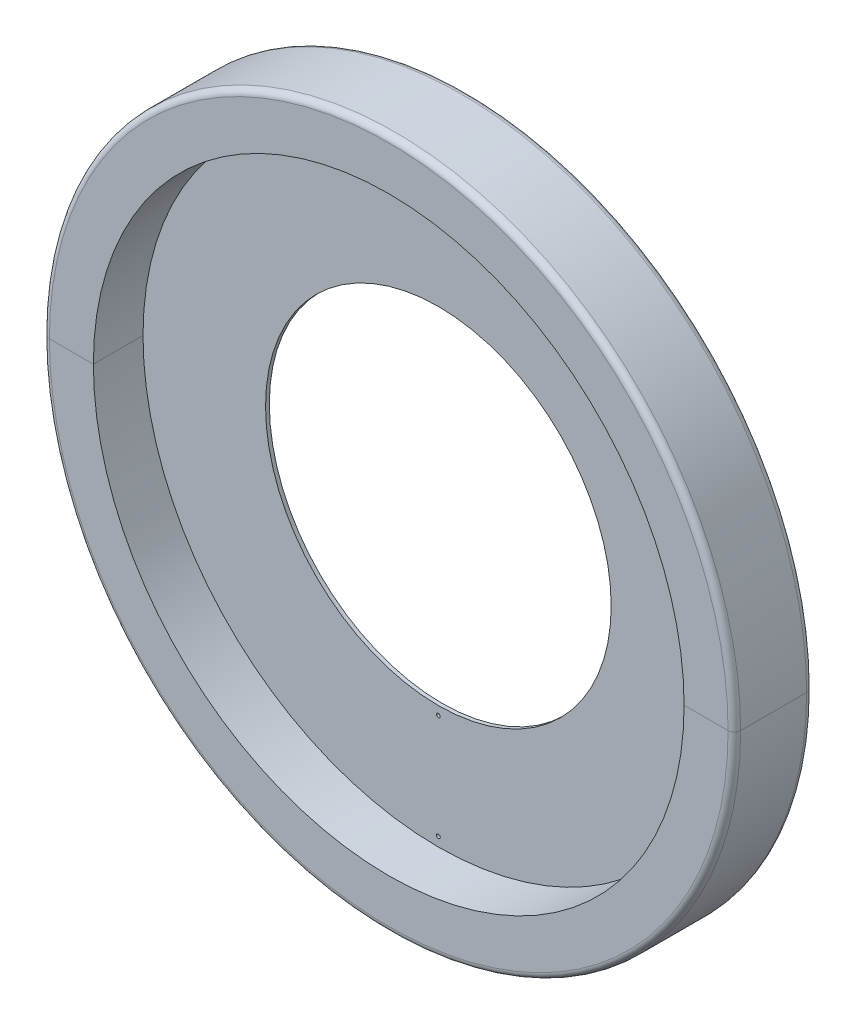
ISO-10303-21;
HEADER;
FILE_DESCRIPTION(('STEP AP214'),'2;1');
FILE_NAME('part.step','',(''),(''),'','','');
FILE_SCHEMA(('AUTOMOTIVE_DESIGN { 1 0 10303 214 1 1 1 1 }'));
ENDSEC;
DATA;
#1=APPLICATION_CONTEXT('core data for automotive mechanical design processes');
#2=APPLICATION_PROTOCOL_DEFINITION('international standard','automotive_design',2000,#1);
#3=PRODUCT_CONTEXT('',#1,'mechanical');
#4=PRODUCT('Part','Part','',(#3));
#5=PRODUCT_RELATED_PRODUCT_CATEGORY('part','',(#4));
#6=PRODUCT_DEFINITION_FORMATION('','',#4);
#7=PRODUCT_DEFINITION_CONTEXT('part definition',#1,'design');
#8=PRODUCT_DEFINITION('design','',#6,#7);
#9=PRODUCT_DEFINITION_SHAPE('','',#8);
#10=(LENGTH_UNIT() NAMED_UNIT(*) SI_UNIT(.MILLI.,.METRE.));
#11=(NAMED_UNIT(*) PLANE_ANGLE_UNIT() SI_UNIT($,.RADIAN.));
#12=(NAMED_UNIT(*) SI_UNIT($,.STERADIAN.) SOLID_ANGLE_UNIT());
#13=UNCERTAINTY_MEASURE_WITH_UNIT(LENGTH_MEASURE(1.E-05),#10,'distance_accuracy_value','');
#14=(GEOMETRIC_REPRESENTATION_CONTEXT(3) GLOBAL_UNCERTAINTY_ASSIGNED_CONTEXT((#13)) GLOBAL_UNIT_ASSIGNED_CONTEXT((#10,
#11,#12)) REPRESENTATION_CONTEXT('',''));
#15=CARTESIAN_POINT('',(0.,0.,0.));
#16=DIRECTION('',(0.,0.,1.));
#17=DIRECTION('',(1.,0.,0.));
#18=AXIS2_PLACEMENT_3D('',#15,#16,#17);
#19=CARTESIAN_POINT('',(0.,0.,6.));
#20=DIRECTION('',(0.,0.,1.));
#21=DIRECTION('',(1.,0.,0.));
#22=AXIS2_PLACEMENT_3D('',#19,#20,#21);
#23=PLANE('',#22);
#24=CARTESIAN_POINT('',(0.,-455.,6.));
#25=DIRECTION('',(0.,0.,1.));
#26=DIRECTION('',(1.,0.,0.));
#27=AXIS2_PLACEMENT_3D('',#24,#25,#26);
#28=CIRCLE('',#27,3.);
#29=CARTESIAN_POINT('',(3.,-455.,6.));
#30=VERTEX_POINT('',#29);
#31=EDGE_CURVE('E224',#30,#30,#28,.T.);
#32=ORIENTED_EDGE('',*,*,#31,.F.);
#33=EDGE_LOOP('',(#32));
#34=FACE_BOUND('',#33,.T.);
#35=CARTESIAN_POINT('',(0.,-288.71,6.));
#36=DIRECTION('',(0.,0.,1.));
#37=DIRECTION('',(1.,0.,0.));
#38=AXIS2_PLACEMENT_3D('',#35,#36,#37);
#39=CIRCLE('',#38,3.);
#40=CARTESIAN_POINT('',(3.,-288.71,6.));
#41=VERTEX_POINT('',#40);
#42=EDGE_CURVE('E228',#41,#41,#39,.T.);
#43=ORIENTED_EDGE('',*,*,#42,.F.);
#44=EDGE_LOOP('',(#43));
#45=FACE_BOUND('',#44,.T.);
#46=CARTESIAN_POINT('',(0.,0.,6.));
#47=DIRECTION('',(0.,0.,1.));
#48=DIRECTION('',(1.,0.,0.));
#49=AXIS2_PLACEMENT_3D('',#46,#47,#48);
#50=CIRCLE('',#49,275.);
#51=CARTESIAN_POINT('',(275.,0.,6.));
#52=VERTEX_POINT('',#51);
#53=EDGE_CURVE('E223',#52,#52,#50,.T.);
#54=ORIENTED_EDGE('',*,*,#53,.F.);
#55=EDGE_LOOP('',(#54));
#56=FACE_BOUND('',#55,.T.);
#57=CARTESIAN_POINT('',(0.,0.,6.));
#58=DIRECTION('',(0.,0.,1.));
#59=DIRECTION('',(1.,0.,0.));
#60=AXIS2_PLACEMENT_3D('',#57,#58,#59);
#61=CIRCLE('',#60,470.);
#62=CARTESIAN_POINT('',(470.,0.,6.));
#63=VERTEX_POINT('',#62);
#64=CARTESIAN_POINT('',(-470.,0.,6.00000000000001));
#65=VERTEX_POINT('',#64);
#66=EDGE_CURVE('E11',#63,#65,#61,.T.);
#67=ORIENTED_EDGE('',*,*,#66,.T.);
#68=EDGE_CURVE('E53',#65,#63,#61,.T.);
#69=ORIENTED_EDGE('',*,*,#68,.T.);
#70=EDGE_LOOP('',(#67,#69));
#71=FACE_BOUND('',#70,.T.);
#72=ADVANCED_FACE('F43',(#34,#45,#56,#71),#23,.T.);
#73=CARTESIAN_POINT('',(0.,0.,0.));
#74=DIRECTION('',(0.,0.,1.));
#75=DIRECTION('',(1.,0.,0.));
#76=AXIS2_PLACEMENT_3D('',#73,#74,#75);
#77=PLANE('',#76);
#78=CARTESIAN_POINT('',(0.,-455.,0.));
#79=DIRECTION('',(0.,0.,1.));
#80=DIRECTION('',(1.,0.,0.));
#81=AXIS2_PLACEMENT_3D('',#78,#79,#80);
#82=CIRCLE('',#81,3.);
#83=CARTESIAN_POINT('',(3.,-455.,0.));
#84=VERTEX_POINT('',#83);
#85=EDGE_CURVE('E219',#84,#84,#82,.T.);
#86=ORIENTED_EDGE('',*,*,#85,.T.);
#87=EDGE_LOOP('',(#86));
#88=FACE_BOUND('',#87,.T.);
#89=CARTESIAN_POINT('',(0.,-288.71,0.));
#90=DIRECTION('',(0.,0.,1.));
#91=DIRECTION('',(1.,0.,0.));
#92=AXIS2_PLACEMENT_3D('',#89,#90,#91);
#93=CIRCLE('',#92,3.);
#94=CARTESIAN_POINT('',(3.,-288.71,0.));
#95=VERTEX_POINT('',#94);
#96=EDGE_CURVE('E232',#95,#95,#93,.T.);
#97=ORIENTED_EDGE('',*,*,#96,.T.);
#98=EDGE_LOOP('',(#97));
#99=FACE_BOUND('',#98,.T.);
#100=CARTESIAN_POINT('',(0.,0.,0.));
#101=DIRECTION('',(0.,0.,1.));
#102=DIRECTION('',(1.,0.,0.));
#103=AXIS2_PLACEMENT_3D('',#100,#101,#102);
#104=CIRCLE('',#103,275.);
#105=CARTESIAN_POINT('',(275.,0.,0.));
#106=VERTEX_POINT('',#105);
#107=EDGE_CURVE('E236',#106,#106,#104,.T.);
#108=ORIENTED_EDGE('',*,*,#107,.T.);
#109=EDGE_LOOP('',(#108));
#110=FACE_BOUND('',#109,.T.);
#111=CARTESIAN_POINT('',(0.,0.,0.));
#112=DIRECTION('',(0.,0.,1.));
#113=DIRECTION('',(1.,0.,0.));
#114=AXIS2_PLACEMENT_3D('',#111,#112,#113);
#115=CIRCLE('',#114,470.);
#116=CARTESIAN_POINT('',(470.,0.,0.));
#117=VERTEX_POINT('',#116);
#118=CARTESIAN_POINT('',(-470.,0.,0.));
#119=VERTEX_POINT('',#118);
#120=EDGE_CURVE('E47',#117,#119,#115,.T.);
#121=ORIENTED_EDGE('',*,*,#120,.F.);
#122=CARTESIAN_POINT('',(0.,0.,0.));
#123=DIRECTION('',(0.,0.,-1.));
#124=DIRECTION('',(1.,0.,0.));
#125=AXIS2_PLACEMENT_3D('',#122,#123,#124);
#126=CIRCLE('',#125,470.);
#127=EDGE_CURVE('E67',#117,#119,#126,.T.);
#128=ORIENTED_EDGE('',*,*,#127,.T.);
#129=EDGE_LOOP('',(#121,#128));
#130=FACE_BOUND('',#129,.T.);
#131=ADVANCED_FACE('F45',(#88,#99,#110,#130),#77,.F.);
#132=CARTESIAN_POINT('',(0.,0.,0.));
#133=DIRECTION('',(0.,0.,1.));
#134=DIRECTION('',(1.,0.,0.));
#135=AXIS2_PLACEMENT_3D('',#132,#133,#134);
#136=CYLINDRICAL_SURFACE('',#135,275.);
#137=ORIENTED_EDGE('',*,*,#107,.F.);
#138=EDGE_LOOP('',(#137));
#139=FACE_BOUND('',#138,.T.);
#140=ORIENTED_EDGE('',*,*,#53,.T.);
#141=EDGE_LOOP('',(#140));
#142=FACE_BOUND('',#141,.T.);
#143=ADVANCED_FACE('F244',(#139,#142),#136,.F.);
#144=CARTESIAN_POINT('',(0.,-288.71,0.));
#145=DIRECTION('',(0.,0.,1.));
#146=DIRECTION('',(1.,0.,0.));
#147=AXIS2_PLACEMENT_3D('',#144,#145,#146);
#148=CYLINDRICAL_SURFACE('',#147,3.);
#149=ORIENTED_EDGE('',*,*,#96,.F.);
#150=EDGE_LOOP('',(#149));
#151=FACE_BOUND('',#150,.T.);
#152=ORIENTED_EDGE('',*,*,#42,.T.);
#153=EDGE_LOOP('',(#152));
#154=FACE_BOUND('',#153,.T.);
#155=ADVANCED_FACE('F260',(#151,#154),#148,.F.);
#156=CARTESIAN_POINT('',(0.,-455.,0.));
#157=DIRECTION('',(0.,0.,1.));
#158=DIRECTION('',(1.,0.,0.));
#159=AXIS2_PLACEMENT_3D('',#156,#157,#158);
#160=CYLINDRICAL_SURFACE('',#159,3.);
#161=ORIENTED_EDGE('',*,*,#85,.F.);
#162=EDGE_LOOP('',(#161));
#163=FACE_BOUND('',#162,.T.);
#164=ORIENTED_EDGE('',*,*,#31,.T.);
#165=EDGE_LOOP('',(#164));
#166=FACE_BOUND('',#165,.T.);
#167=ADVANCED_FACE('F264',(#163,#166),#160,.F.);
#168=CARTESIAN_POINT('',(0.,0.,0.));
#169=DIRECTION('',(0.,0.,-1.));
#170=DIRECTION('',(-1.,0.,0.));
#171=AXIS2_PLACEMENT_3D('',#168,#169,#170);
#172=CYLINDRICAL_SURFACE('',#171,470.);
#173=ORIENTED_EDGE('',*,*,#66,.F.);
#174=DIRECTION('',(0.,0.,-1.));
#175=VECTOR('',#174,1.);
#176=CARTESIAN_POINT('',(470.,0.,85.));
#177=LINE('',#176,#175);
#178=CARTESIAN_POINT('',(470.,0.,85.));
#179=VERTEX_POINT('',#178);
#180=EDGE_CURVE('E60',#179,#63,#177,.T.);
#181=ORIENTED_EDGE('',*,*,#180,.F.);
#182=CARTESIAN_POINT('',(0.,0.,85.));
#183=DIRECTION('',(0.,0.,-1.));
#184=DIRECTION('',(-1.,0.,0.));
#185=AXIS2_PLACEMENT_3D('',#182,#183,#184);
#186=CIRCLE('',#185,470.);
#187=CARTESIAN_POINT('',(-470.,0.,85.));
#188=VERTEX_POINT('',#187);
#189=EDGE_CURVE('E124',#188,#179,#186,.T.);
#190=ORIENTED_EDGE('',*,*,#189,.F.);
#191=DIRECTION('',(0.,0.,-1.));
#192=VECTOR('',#191,1.);
#193=CARTESIAN_POINT('',(-470.,0.,85.));
#194=LINE('',#193,#192);
#195=EDGE_CURVE('E126',#188,#65,#194,.T.);
#196=ORIENTED_EDGE('',*,*,#195,.T.);
#197=EDGE_LOOP('',(#173,#181,#190,#196));
#198=FACE_BOUND('',#197,.T.);
#199=ADVANCED_FACE('F125',(#198),#172,.F.);
#200=CARTESIAN_POINT('',(0.,0.,0.));
#201=DIRECTION('',(0.,0.,-1.));
#202=DIRECTION('',(-1.,0.,0.));
#203=AXIS2_PLACEMENT_3D('',#200,#201,#202);
#204=CYLINDRICAL_SURFACE('',#203,470.);
#205=ORIENTED_EDGE('',*,*,#68,.F.);
#206=ORIENTED_EDGE('',*,*,#195,.F.);
#207=CARTESIAN_POINT('',(0.,0.,85.));
#208=DIRECTION('',(0.,0.,-1.));
#209=DIRECTION('',(1.,0.,0.));
#210=AXIS2_PLACEMENT_3D('',#207,#208,#209);
#211=CIRCLE('',#210,470.);
#212=EDGE_CURVE('E110',#179,#188,#211,.T.);
#213=ORIENTED_EDGE('',*,*,#212,.F.);
#214=ORIENTED_EDGE('',*,*,#180,.T.);
#215=EDGE_LOOP('',(#205,#206,#213,#214));
#216=FACE_BOUND('',#215,.T.);
#217=ADVANCED_FACE('F137',(#216),#204,.F.);
#218=CARTESIAN_POINT('',(540.,0.,85.));
#219=DIRECTION('',(0.,0.,1.));
#220=DIRECTION('',(1.,0.,0.));
#221=AXIS2_PLACEMENT_3D('',#218,#219,#220);
#222=PLANE('',#221);
#223=CARTESIAN_POINT('',(0.,0.,85.));
#224=DIRECTION('',(0.,0.,-1.));
#225=DIRECTION('',(1.,0.,0.));
#226=AXIS2_PLACEMENT_3D('',#223,#224,#225);
#227=CIRCLE('',#226,540.);
#228=CARTESIAN_POINT('',(540.,0.,85.));
#229=VERTEX_POINT('',#228);
#230=CARTESIAN_POINT('',(-540.,0.,85.));
#231=VERTEX_POINT('',#230);
#232=EDGE_CURVE('E207',#229,#231,#227,.T.);
#233=ORIENTED_EDGE('',*,*,#232,.F.);
#234=DIRECTION('',(-1.,0.,0.));
#235=VECTOR('',#234,1.);
#236=CARTESIAN_POINT('',(540.,0.,85.));
#237=LINE('',#236,#235);
#238=EDGE_CURVE('E117',#229,#179,#237,.T.);
#239=ORIENTED_EDGE('',*,*,#238,.T.);
#240=ORIENTED_EDGE('',*,*,#212,.T.);
#241=DIRECTION('',(1.,0.,0.));
#242=VECTOR('',#241,1.);
#243=CARTESIAN_POINT('',(-540.,0.,85.));
#244=LINE('',#243,#242);
#245=EDGE_CURVE('E114',#231,#188,#244,.T.);
#246=ORIENTED_EDGE('',*,*,#245,.F.);
#247=EDGE_LOOP('',(#233,#239,#240,#246));
#248=FACE_BOUND('',#247,.T.);
#249=ADVANCED_FACE('F112',(#248),#222,.T.);
#250=CARTESIAN_POINT('',(0.,0.,75.));
#251=DIRECTION('',(0.,0.,-1.));
#252=DIRECTION('',(-1.,0.,0.));
#253=AXIS2_PLACEMENT_3D('',#250,#251,#252);
#254=TOROIDAL_SURFACE('',#253,540.,10.);
#255=CARTESIAN_POINT('',(0.,0.,74.9999999999999));
#256=DIRECTION('',(0.,0.,-1.));
#257=DIRECTION('',(1.,0.,0.));
#258=AXIS2_PLACEMENT_3D('',#255,#256,#257);
#259=CIRCLE('',#258,550.);
#260=CARTESIAN_POINT('',(550.,0.,74.9999999999999));
#261=VERTEX_POINT('',#260);
#262=CARTESIAN_POINT('',(-550.,0.,74.9999999999999));
#263=VERTEX_POINT('',#262);
#264=EDGE_CURVE('E193',#261,#263,#259,.T.);
#265=ORIENTED_EDGE('',*,*,#264,.F.);
#266=CARTESIAN_POINT('',(540.,0.,75.));
#267=DIRECTION('',(0.,-1.,0.));
#268=DIRECTION('',(0.,0.,1.));
#269=AXIS2_PLACEMENT_3D('',#266,#267,#268);
#270=CIRCLE('',#269,10.);
#271=EDGE_CURVE('E204',#261,#229,#270,.T.);
#272=ORIENTED_EDGE('',*,*,#271,.T.);
#273=ORIENTED_EDGE('',*,*,#232,.T.);
#274=CARTESIAN_POINT('',(-540.,0.,75.));
#275=DIRECTION('',(0.,1.,0.));
#276=DIRECTION('',(0.,0.,1.));
#277=AXIS2_PLACEMENT_3D('',#274,#275,#276);
#278=CIRCLE('',#277,10.);
#279=EDGE_CURVE('E135',#263,#231,#278,.T.);
#280=ORIENTED_EDGE('',*,*,#279,.F.);
#281=EDGE_LOOP('',(#265,#272,#273,#280));
#282=FACE_BOUND('',#281,.T.);
#283=ADVANCED_FACE('F271',(#282),#254,.T.);
#284=CARTESIAN_POINT('',(0.,0.,0.));
#285=DIRECTION('',(0.,0.,-1.));
#286=DIRECTION('',(-1.,0.,0.));
#287=AXIS2_PLACEMENT_3D('',#284,#285,#286);
#288=CYLINDRICAL_SURFACE('',#287,550.);
#289=CARTESIAN_POINT('',(0.,0.,-29.9999999999999));
#290=DIRECTION('',(0.,0.,-1.));
#291=DIRECTION('',(1.,0.,0.));
#292=AXIS2_PLACEMENT_3D('',#289,#290,#291);
#293=CIRCLE('',#292,550.);
#294=CARTESIAN_POINT('',(550.,0.,-29.9999999999999));
#295=VERTEX_POINT('',#294);
#296=CARTESIAN_POINT('',(-550.,0.,-29.9999999999999));
#297=VERTEX_POINT('',#296);
#298=EDGE_CURVE('E178',#295,#297,#293,.T.);
#299=ORIENTED_EDGE('',*,*,#298,.F.);
#300=DIRECTION('',(0.,0.,1.));
#301=VECTOR('',#300,1.);
#302=CARTESIAN_POINT('',(550.,0.,-29.9999999999999));
#303=LINE('',#302,#301);
#304=EDGE_CURVE('E190',#295,#261,#303,.T.);
#305=ORIENTED_EDGE('',*,*,#304,.T.);
#306=ORIENTED_EDGE('',*,*,#264,.T.);
#307=DIRECTION('',(0.,0.,1.));
#308=VECTOR('',#307,1.);
#309=CARTESIAN_POINT('',(-550.,0.,-29.9999999999999));
#310=LINE('',#309,#308);
#311=EDGE_CURVE('E182',#297,#263,#310,.T.);
#312=ORIENTED_EDGE('',*,*,#311,.F.);
#313=EDGE_LOOP('',(#299,#305,#306,#312));
#314=FACE_BOUND('',#313,.T.);
#315=ADVANCED_FACE('F278',(#314),#288,.T.);
#316=CARTESIAN_POINT('',(0.,0.,-30.));
#317=DIRECTION('',(0.,0.,-1.));
#318=DIRECTION('',(-1.,0.,0.));
#319=AXIS2_PLACEMENT_3D('',#316,#317,#318);
#320=TOROIDAL_SURFACE('',#319,540.,10.);
#321=CARTESIAN_POINT('',(0.,0.,-40.));
#322=DIRECTION('',(0.,0.,-1.));
#323=DIRECTION('',(1.,0.,0.));
#324=AXIS2_PLACEMENT_3D('',#321,#322,#323);
#325=CIRCLE('',#324,540.);
#326=CARTESIAN_POINT('',(540.,0.,-40.));
#327=VERTEX_POINT('',#326);
#328=CARTESIAN_POINT('',(-540.,0.,-40.));
#329=VERTEX_POINT('',#328);
#330=EDGE_CURVE('E163',#327,#329,#325,.T.);
#331=ORIENTED_EDGE('',*,*,#330,.F.);
#332=CARTESIAN_POINT('',(540.,0.,-30.));
#333=DIRECTION('',(0.,-1.,0.));
#334=DIRECTION('',(0.,0.,-1.));
#335=AXIS2_PLACEMENT_3D('',#332,#333,#334);
#336=CIRCLE('',#335,10.);
#337=EDGE_CURVE('E175',#327,#295,#336,.T.);
#338=ORIENTED_EDGE('',*,*,#337,.T.);
#339=ORIENTED_EDGE('',*,*,#298,.T.);
#340=CARTESIAN_POINT('',(-540.,0.,-30.));
#341=DIRECTION('',(0.,1.,0.));
#342=DIRECTION('',(0.,0.,-1.));
#343=AXIS2_PLACEMENT_3D('',#340,#341,#342);
#344=CIRCLE('',#343,10.);
#345=EDGE_CURVE('E167',#329,#297,#344,.T.);
#346=ORIENTED_EDGE('',*,*,#345,.F.);
#347=EDGE_LOOP('',(#331,#338,#339,#346));
#348=FACE_BOUND('',#347,.T.);
#349=ADVANCED_FACE('F286',(#348),#320,.T.);
#350=CARTESIAN_POINT('',(470.,0.,-40.));
#351=DIRECTION('',(0.,0.,-1.));
#352=DIRECTION('',(-1.,0.,0.));
#353=AXIS2_PLACEMENT_3D('',#350,#351,#352);
#354=PLANE('',#353);
#355=CARTESIAN_POINT('',(0.,0.,-40.));
#356=DIRECTION('',(0.,0.,-1.));
#357=DIRECTION('',(1.,0.,0.));
#358=AXIS2_PLACEMENT_3D('',#355,#356,#357);
#359=CIRCLE('',#358,470.);
#360=CARTESIAN_POINT('',(470.,0.,-40.));
#361=VERTEX_POINT('',#360);
#362=CARTESIAN_POINT('',(-470.,0.,-40.));
#363=VERTEX_POINT('',#362);
#364=EDGE_CURVE('E151',#361,#363,#359,.T.);
#365=ORIENTED_EDGE('',*,*,#364,.F.);
#366=DIRECTION('',(1.,0.,0.));
#367=VECTOR('',#366,1.);
#368=CARTESIAN_POINT('',(470.,0.,-40.));
#369=LINE('',#368,#367);
#370=EDGE_CURVE('E160',#361,#327,#369,.T.);
#371=ORIENTED_EDGE('',*,*,#370,.T.);
#372=ORIENTED_EDGE('',*,*,#330,.T.);
#373=DIRECTION('',(-1.,0.,0.));
#374=VECTOR('',#373,1.);
#375=CARTESIAN_POINT('',(-470.,0.,-40.));
#376=LINE('',#375,#374);
#377=EDGE_CURVE('E144',#363,#329,#376,.T.);
#378=ORIENTED_EDGE('',*,*,#377,.F.);
#379=EDGE_LOOP('',(#365,#371,#372,#378));
#380=FACE_BOUND('',#379,.T.);
#381=ADVANCED_FACE('F294',(#380),#354,.T.);
#382=CARTESIAN_POINT('',(0.,0.,0.));
#383=DIRECTION('',(0.,0.,-1.));
#384=DIRECTION('',(-1.,0.,0.));
#385=AXIS2_PLACEMENT_3D('',#382,#383,#384);
#386=CYLINDRICAL_SURFACE('',#385,470.);
#387=ORIENTED_EDGE('',*,*,#127,.F.);
#388=DIRECTION('',(0.,0.,-1.));
#389=VECTOR('',#388,1.);
#390=CARTESIAN_POINT('',(470.,0.,0.));
#391=LINE('',#390,#389);
#392=EDGE_CURVE('E148',#117,#361,#391,.T.);
#393=ORIENTED_EDGE('',*,*,#392,.T.);
#394=ORIENTED_EDGE('',*,*,#364,.T.);
#395=DIRECTION('',(0.,0.,-1.));
#396=VECTOR('',#395,1.);
#397=CARTESIAN_POINT('',(-470.,0.,0.));
#398=LINE('',#397,#396);
#399=EDGE_CURVE('E140',#119,#363,#398,.T.);
#400=ORIENTED_EDGE('',*,*,#399,.F.);
#401=EDGE_LOOP('',(#387,#393,#394,#400));
#402=FACE_BOUND('',#401,.T.);
#403=ADVANCED_FACE('F275',(#402),#386,.F.);
#404=CARTESIAN_POINT('',(-540.,0.,85.));
#405=DIRECTION('',(0.,0.,1.));
#406=DIRECTION('',(1.,0.,0.));
#407=AXIS2_PLACEMENT_3D('',#404,#405,#406);
#408=PLANE('',#407);
#409=ORIENTED_EDGE('',*,*,#238,.F.);
#410=CARTESIAN_POINT('',(0.,0.,85.));
#411=DIRECTION('',(0.,0.,-1.));
#412=DIRECTION('',(-1.,0.,0.));
#413=AXIS2_PLACEMENT_3D('',#410,#411,#412);
#414=CIRCLE('',#413,540.);
#415=EDGE_CURVE('E133',#231,#229,#414,.T.);
#416=ORIENTED_EDGE('',*,*,#415,.F.);
#417=ORIENTED_EDGE('',*,*,#245,.T.);
#418=ORIENTED_EDGE('',*,*,#189,.T.);
#419=EDGE_LOOP('',(#409,#416,#417,#418));
#420=FACE_BOUND('',#419,.T.);
#421=ADVANCED_FACE('F131',(#420),#408,.T.);
#422=CARTESIAN_POINT('',(0.,0.,75.));
#423=DIRECTION('',(0.,0.,-1.));
#424=DIRECTION('',(-1.,0.,0.));
#425=AXIS2_PLACEMENT_3D('',#422,#423,#424);
#426=TOROIDAL_SURFACE('',#425,540.,10.);
#427=ORIENTED_EDGE('',*,*,#415,.T.);
#428=ORIENTED_EDGE('',*,*,#271,.F.);
#429=CARTESIAN_POINT('',(0.,0.,74.9999999999999));
#430=DIRECTION('',(0.,0.,-1.));
#431=DIRECTION('',(-1.,0.,0.));
#432=AXIS2_PLACEMENT_3D('',#429,#430,#431);
#433=CIRCLE('',#432,550.);
#434=EDGE_CURVE('E200',#263,#261,#433,.T.);
#435=ORIENTED_EDGE('',*,*,#434,.F.);
#436=ORIENTED_EDGE('',*,*,#279,.T.);
#437=EDGE_LOOP('',(#427,#428,#435,#436));
#438=FACE_BOUND('',#437,.T.);
#439=ADVANCED_FACE('F274',(#438),#426,.T.);
#440=CARTESIAN_POINT('',(0.,0.,0.));
#441=DIRECTION('',(0.,0.,-1.));
#442=DIRECTION('',(-1.,0.,0.));
#443=AXIS2_PLACEMENT_3D('',#440,#441,#442);
#444=CYLINDRICAL_SURFACE('',#443,550.);
#445=ORIENTED_EDGE('',*,*,#434,.T.);
#446=ORIENTED_EDGE('',*,*,#304,.F.);
#447=CARTESIAN_POINT('',(0.,0.,-29.9999999999999));
#448=DIRECTION('',(0.,0.,-1.));
#449=DIRECTION('',(-1.,0.,0.));
#450=AXIS2_PLACEMENT_3D('',#447,#448,#449);
#451=CIRCLE('',#450,550.);
#452=EDGE_CURVE('E186',#297,#295,#451,.T.);
#453=ORIENTED_EDGE('',*,*,#452,.F.);
#454=ORIENTED_EDGE('',*,*,#311,.T.);
#455=EDGE_LOOP('',(#445,#446,#453,#454));
#456=FACE_BOUND('',#455,.T.);
#457=ADVANCED_FACE('F282',(#456),#444,.T.);
#458=CARTESIAN_POINT('',(0.,0.,-30.));
#459=DIRECTION('',(0.,0.,-1.));
#460=DIRECTION('',(-1.,0.,0.));
#461=AXIS2_PLACEMENT_3D('',#458,#459,#460);
#462=TOROIDAL_SURFACE('',#461,540.,10.);
#463=ORIENTED_EDGE('',*,*,#452,.T.);
#464=ORIENTED_EDGE('',*,*,#337,.F.);
#465=CARTESIAN_POINT('',(0.,0.,-40.));
#466=DIRECTION('',(0.,0.,-1.));
#467=DIRECTION('',(-1.,0.,0.));
#468=AXIS2_PLACEMENT_3D('',#465,#466,#467);
#469=CIRCLE('',#468,540.);
#470=EDGE_CURVE('E171',#329,#327,#469,.T.);
#471=ORIENTED_EDGE('',*,*,#470,.F.);
#472=ORIENTED_EDGE('',*,*,#345,.T.);
#473=EDGE_LOOP('',(#463,#464,#471,#472));
#474=FACE_BOUND('',#473,.T.);
#475=ADVANCED_FACE('F290',(#474),#462,.T.);
#476=CARTESIAN_POINT('',(-470.,0.,-40.));
#477=DIRECTION('',(0.,0.,-1.));
#478=DIRECTION('',(-1.,0.,0.));
#479=AXIS2_PLACEMENT_3D('',#476,#477,#478);
#480=PLANE('',#479);
#481=ORIENTED_EDGE('',*,*,#470,.T.);
#482=ORIENTED_EDGE('',*,*,#370,.F.);
#483=CARTESIAN_POINT('',(0.,0.,-40.));
#484=DIRECTION('',(0.,0.,-1.));
#485=DIRECTION('',(-1.,0.,0.));
#486=AXIS2_PLACEMENT_3D('',#483,#484,#485);
#487=CIRCLE('',#486,470.);
#488=EDGE_CURVE('E156',#363,#361,#487,.T.);
#489=ORIENTED_EDGE('',*,*,#488,.F.);
#490=ORIENTED_EDGE('',*,*,#377,.T.);
#491=EDGE_LOOP('',(#481,#482,#489,#490));
#492=FACE_BOUND('',#491,.T.);
#493=ADVANCED_FACE('F298',(#492),#480,.T.);
#494=CARTESIAN_POINT('',(0.,0.,0.));
#495=DIRECTION('',(0.,0.,-1.));
#496=DIRECTION('',(-1.,0.,0.));
#497=AXIS2_PLACEMENT_3D('',#494,#495,#496);
#498=CYLINDRICAL_SURFACE('',#497,470.);
#499=ORIENTED_EDGE('',*,*,#488,.T.);
#500=ORIENTED_EDGE('',*,*,#392,.F.);
#501=ORIENTED_EDGE('',*,*,#120,.T.);
#502=ORIENTED_EDGE('',*,*,#399,.T.);
#503=EDGE_LOOP('',(#499,#500,#501,#502));
#504=FACE_BOUND('',#503,.T.);
#505=ADVANCED_FACE('F305',(#504),#498,.F.);
#506=CLOSED_SHELL('',(#72,#131,#143,#155,#167,#199,#217,#249,#283,#315,#349,#381,#403,#421,#439,
#457,#475,#493,#505));
#507=MANIFOLD_SOLID_BREP('B2',#506);
#508=ADVANCED_BREP_SHAPE_REPRESENTATION('',(#18,#507),#14);
#509=SHAPE_DEFINITION_REPRESENTATION(#9,#508);
ENDSEC;
END-ISO-10303-21;
